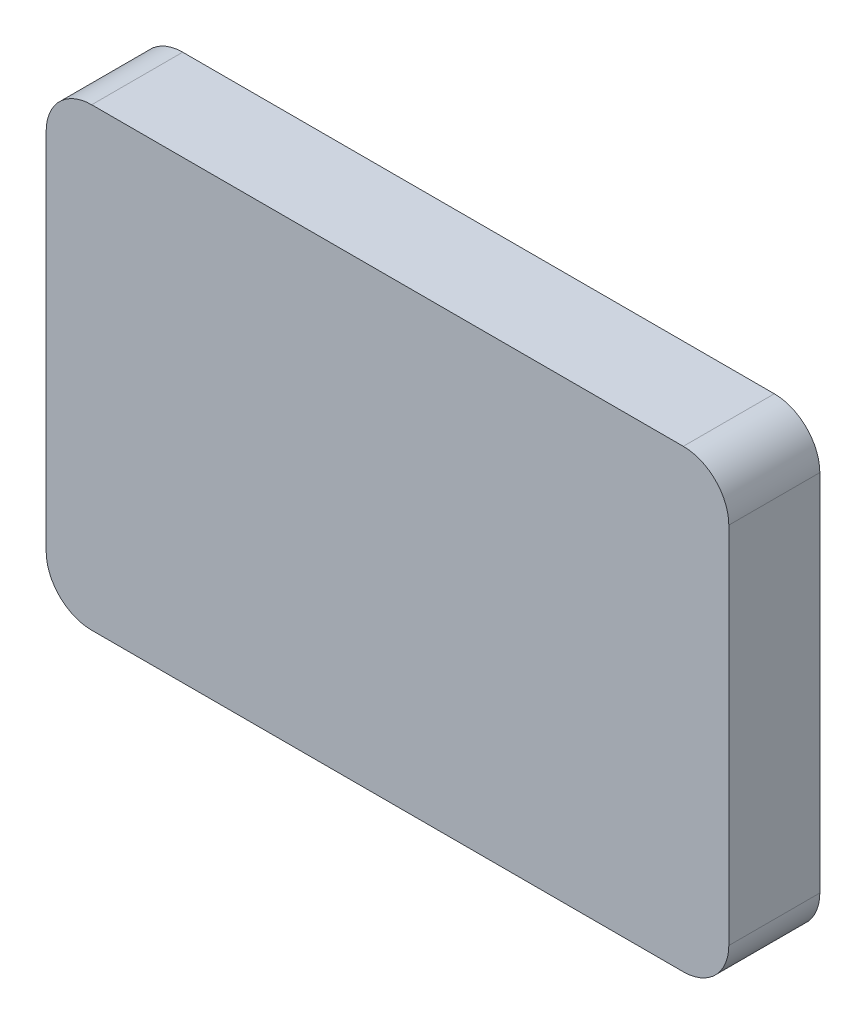
ISO-10303-21;
HEADER;
FILE_DESCRIPTION(('STEP AP214'),'2;1');
FILE_NAME('part.step','',(''),(''),'','','');
FILE_SCHEMA(('AUTOMOTIVE_DESIGN { 1 0 10303 214 1 1 1 1 }'));
ENDSEC;
DATA;
#1=APPLICATION_CONTEXT('core data for automotive mechanical design processes');
#2=APPLICATION_PROTOCOL_DEFINITION('international standard','automotive_design',2000,#1);
#3=PRODUCT_CONTEXT('',#1,'mechanical');
#4=PRODUCT('Part','Part','',(#3));
#5=PRODUCT_RELATED_PRODUCT_CATEGORY('part','',(#4));
#6=PRODUCT_DEFINITION_FORMATION('','',#4);
#7=PRODUCT_DEFINITION_CONTEXT('part definition',#1,'design');
#8=PRODUCT_DEFINITION('design','',#6,#7);
#9=PRODUCT_DEFINITION_SHAPE('','',#8);
#10=(LENGTH_UNIT() NAMED_UNIT(*) SI_UNIT(.MILLI.,.METRE.));
#11=(NAMED_UNIT(*) PLANE_ANGLE_UNIT() SI_UNIT($,.RADIAN.));
#12=(NAMED_UNIT(*) SI_UNIT($,.STERADIAN.) SOLID_ANGLE_UNIT());
#13=UNCERTAINTY_MEASURE_WITH_UNIT(LENGTH_MEASURE(1.E-05),#10,'distance_accuracy_value','');
#14=(GEOMETRIC_REPRESENTATION_CONTEXT(3) GLOBAL_UNCERTAINTY_ASSIGNED_CONTEXT((#13)) GLOBAL_UNIT_ASSIGNED_CONTEXT((#10,
#11,#12)) REPRESENTATION_CONTEXT('',''));
#15=CARTESIAN_POINT('',(0.,0.,0.));
#16=DIRECTION('',(0.,0.,1.));
#17=DIRECTION('',(1.,0.,0.));
#18=AXIS2_PLACEMENT_3D('',#15,#16,#17);
#19=CARTESIAN_POINT('',(0.,0.,2.));
#20=DIRECTION('',(0.,1.,0.));
#21=DIRECTION('',(0.,0.,1.));
#22=AXIS2_PLACEMENT_3D('',#19,#20,#21);
#23=PLANE('',#22);
#24=DIRECTION('',(1.,0.,0.));
#25=VECTOR('',#24,1.);
#26=CARTESIAN_POINT('',(0.,0.,2.));
#27=LINE('',#26,#25);
#28=CARTESIAN_POINT('',(1.,0.,2.));
#29=VERTEX_POINT('',#28);
#30=CARTESIAN_POINT('',(14.,0.,2.));
#31=VERTEX_POINT('',#30);
#32=EDGE_CURVE('E120',#29,#31,#27,.T.);
#33=ORIENTED_EDGE('',*,*,#32,.F.);
#34=DIRECTION('',(0.,0.,-1.));
#35=VECTOR('',#34,1.);
#36=CARTESIAN_POINT('',(1.,0.,0.));
#37=LINE('',#36,#35);
#38=CARTESIAN_POINT('',(1.,0.,0.));
#39=VERTEX_POINT('',#38);
#40=EDGE_CURVE('E105',#29,#39,#37,.T.);
#41=ORIENTED_EDGE('',*,*,#40,.T.);
#42=DIRECTION('',(1.,0.,0.));
#43=VECTOR('',#42,1.);
#44=CARTESIAN_POINT('',(0.,0.,0.));
#45=LINE('',#44,#43);
#46=CARTESIAN_POINT('',(14.,0.,0.));
#47=VERTEX_POINT('',#46);
#48=EDGE_CURVE('E117',#39,#47,#45,.T.);
#49=ORIENTED_EDGE('',*,*,#48,.T.);
#50=DIRECTION('',(0.,0.,-1.));
#51=VECTOR('',#50,1.);
#52=CARTESIAN_POINT('',(14.,0.,2.));
#53=LINE('',#52,#51);
#54=EDGE_CURVE('E122',#47,#31,#53,.F.);
#55=ORIENTED_EDGE('',*,*,#54,.T.);
#56=EDGE_LOOP('',(#33,#41,#49,#55));
#57=FACE_BOUND('',#56,.T.);
#58=ADVANCED_FACE('F35',(#57),#23,.F.);
#59=CARTESIAN_POINT('',(15.,0.,2.));
#60=DIRECTION('',(-1.,0.,0.));
#61=DIRECTION('',(0.,0.,1.));
#62=AXIS2_PLACEMENT_3D('',#59,#60,#61);
#63=PLANE('',#62);
#64=DIRECTION('',(0.,1.,0.));
#65=VECTOR('',#64,1.);
#66=CARTESIAN_POINT('',(15.,0.,2.));
#67=LINE('',#66,#65);
#68=CARTESIAN_POINT('',(15.,1.,2.));
#69=VERTEX_POINT('',#68);
#70=CARTESIAN_POINT('',(15.,9.,2.));
#71=VERTEX_POINT('',#70);
#72=EDGE_CURVE('E163',#69,#71,#67,.T.);
#73=ORIENTED_EDGE('',*,*,#72,.F.);
#74=DIRECTION('',(0.,0.,-1.));
#75=VECTOR('',#74,1.);
#76=CARTESIAN_POINT('',(15.,1.,2.));
#77=LINE('',#76,#75);
#78=CARTESIAN_POINT('',(15.,1.,0.));
#79=VERTEX_POINT('',#78);
#80=EDGE_CURVE('E156',#69,#79,#77,.T.);
#81=ORIENTED_EDGE('',*,*,#80,.T.);
#82=DIRECTION('',(0.,1.,0.));
#83=VECTOR('',#82,1.);
#84=CARTESIAN_POINT('',(15.,0.,0.));
#85=LINE('',#84,#83);
#86=CARTESIAN_POINT('',(15.,9.,0.));
#87=VERTEX_POINT('',#86);
#88=EDGE_CURVE('E126',#79,#87,#85,.T.);
#89=ORIENTED_EDGE('',*,*,#88,.T.);
#90=DIRECTION('',(0.,0.,-1.));
#91=VECTOR('',#90,1.);
#92=CARTESIAN_POINT('',(15.,9.,2.));
#93=LINE('',#92,#91);
#94=EDGE_CURVE('E154',#87,#71,#93,.F.);
#95=ORIENTED_EDGE('',*,*,#94,.T.);
#96=EDGE_LOOP('',(#73,#81,#89,#95));
#97=FACE_BOUND('',#96,.T.);
#98=ADVANCED_FACE('F161',(#97),#63,.F.);
#99=CARTESIAN_POINT('',(0.,10.,2.));
#100=DIRECTION('',(0.,1.,0.));
#101=DIRECTION('',(0.,0.,1.));
#102=AXIS2_PLACEMENT_3D('',#99,#100,#101);
#103=PLANE('',#102);
#104=DIRECTION('',(1.,0.,0.));
#105=VECTOR('',#104,1.);
#106=CARTESIAN_POINT('',(0.,10.,2.));
#107=LINE('',#106,#105);
#108=CARTESIAN_POINT('',(1.,10.,2.));
#109=VERTEX_POINT('',#108);
#110=CARTESIAN_POINT('',(14.,10.,2.));
#111=VERTEX_POINT('',#110);
#112=EDGE_CURVE('E170',#109,#111,#107,.T.);
#113=ORIENTED_EDGE('',*,*,#112,.T.);
#114=DIRECTION('',(0.,0.,-1.));
#115=VECTOR('',#114,1.);
#116=CARTESIAN_POINT('',(14.,10.,0.));
#117=LINE('',#116,#115);
#118=CARTESIAN_POINT('',(14.,10.,0.));
#119=VERTEX_POINT('',#118);
#120=EDGE_CURVE('E11',#111,#119,#117,.T.);
#121=ORIENTED_EDGE('',*,*,#120,.T.);
#122=DIRECTION('',(1.,0.,0.));
#123=VECTOR('',#122,1.);
#124=CARTESIAN_POINT('',(0.,10.,0.));
#125=LINE('',#124,#123);
#126=CARTESIAN_POINT('',(1.,10.,0.));
#127=VERTEX_POINT('',#126);
#128=EDGE_CURVE('E129',#127,#119,#125,.T.);
#129=ORIENTED_EDGE('',*,*,#128,.F.);
#130=DIRECTION('',(0.,0.,-1.));
#131=VECTOR('',#130,1.);
#132=CARTESIAN_POINT('',(1.,10.,2.));
#133=LINE('',#132,#131);
#134=EDGE_CURVE('E43',#127,#109,#133,.F.);
#135=ORIENTED_EDGE('',*,*,#134,.T.);
#136=EDGE_LOOP('',(#113,#121,#129,#135));
#137=FACE_BOUND('',#136,.T.);
#138=ADVANCED_FACE('F169',(#137),#103,.T.);
#139=CARTESIAN_POINT('',(0.,0.,2.));
#140=DIRECTION('',(-1.,0.,0.));
#141=DIRECTION('',(0.,0.,1.));
#142=AXIS2_PLACEMENT_3D('',#139,#140,#141);
#143=PLANE('',#142);
#144=DIRECTION('',(0.,1.,0.));
#145=VECTOR('',#144,1.);
#146=CARTESIAN_POINT('',(0.,0.,0.));
#147=LINE('',#146,#145);
#148=CARTESIAN_POINT('',(0.,1.,0.));
#149=VERTEX_POINT('',#148);
#150=CARTESIAN_POINT('',(0.,9.,0.));
#151=VERTEX_POINT('',#150);
#152=EDGE_CURVE('E137',#149,#151,#147,.T.);
#153=ORIENTED_EDGE('',*,*,#152,.F.);
#154=DIRECTION('',(0.,0.,-1.));
#155=VECTOR('',#154,1.);
#156=CARTESIAN_POINT('',(0.,1.,2.));
#157=LINE('',#156,#155);
#158=CARTESIAN_POINT('',(0.,1.,2.));
#159=VERTEX_POINT('',#158);
#160=EDGE_CURVE('E106',#149,#159,#157,.F.);
#161=ORIENTED_EDGE('',*,*,#160,.T.);
#162=DIRECTION('',(0.,1.,0.));
#163=VECTOR('',#162,1.);
#164=CARTESIAN_POINT('',(0.,0.,2.));
#165=LINE('',#164,#163);
#166=CARTESIAN_POINT('',(0.,9.,2.));
#167=VERTEX_POINT('',#166);
#168=EDGE_CURVE('E132',#159,#167,#165,.T.);
#169=ORIENTED_EDGE('',*,*,#168,.T.);
#170=DIRECTION('',(0.,0.,-1.));
#171=VECTOR('',#170,1.);
#172=CARTESIAN_POINT('',(0.,9.,2.));
#173=LINE('',#172,#171);
#174=EDGE_CURVE('E111',#167,#151,#173,.T.);
#175=ORIENTED_EDGE('',*,*,#174,.T.);
#176=EDGE_LOOP('',(#153,#161,#169,#175));
#177=FACE_BOUND('',#176,.T.);
#178=ADVANCED_FACE('F194',(#177),#143,.T.);
#179=CARTESIAN_POINT('',(0.,0.,2.));
#180=DIRECTION('',(0.,0.,1.));
#181=DIRECTION('',(1.,0.,0.));
#182=AXIS2_PLACEMENT_3D('',#179,#180,#181);
#183=PLANE('',#182);
#184=ORIENTED_EDGE('',*,*,#168,.F.);
#185=CARTESIAN_POINT('',(1.,1.,2.));
#186=DIRECTION('',(0.,0.,1.));
#187=DIRECTION('',(1.,0.,0.));
#188=AXIS2_PLACEMENT_3D('',#185,#186,#187);
#189=CIRCLE('',#188,1.);
#190=EDGE_CURVE('E152',#159,#29,#189,.T.);
#191=ORIENTED_EDGE('',*,*,#190,.T.);
#192=ORIENTED_EDGE('',*,*,#32,.T.);
#193=CARTESIAN_POINT('',(14.,1.,2.));
#194=DIRECTION('',(0.,0.,1.));
#195=DIRECTION('',(1.,0.,0.));
#196=AXIS2_PLACEMENT_3D('',#193,#194,#195);
#197=CIRCLE('',#196,1.);
#198=EDGE_CURVE('E150',#31,#69,#197,.T.);
#199=ORIENTED_EDGE('',*,*,#198,.T.);
#200=ORIENTED_EDGE('',*,*,#72,.T.);
#201=CARTESIAN_POINT('',(14.,9.,2.));
#202=DIRECTION('',(0.,0.,1.));
#203=DIRECTION('',(1.,0.,0.));
#204=AXIS2_PLACEMENT_3D('',#201,#202,#203);
#205=CIRCLE('',#204,1.);
#206=EDGE_CURVE('E50',#71,#111,#205,.T.);
#207=ORIENTED_EDGE('',*,*,#206,.T.);
#208=ORIENTED_EDGE('',*,*,#112,.F.);
#209=CARTESIAN_POINT('',(1.,9.,2.));
#210=DIRECTION('',(0.,0.,1.));
#211=DIRECTION('',(1.,0.,0.));
#212=AXIS2_PLACEMENT_3D('',#209,#210,#211);
#213=CIRCLE('',#212,1.);
#214=EDGE_CURVE('E147',#109,#167,#213,.T.);
#215=ORIENTED_EDGE('',*,*,#214,.T.);
#216=EDGE_LOOP('',(#184,#191,#192,#199,#200,#207,#208,#215));
#217=FACE_BOUND('',#216,.T.);
#218=ADVANCED_FACE('F176',(#217),#183,.T.);
#219=CARTESIAN_POINT('',(0.,0.,0.));
#220=DIRECTION('',(0.,0.,1.));
#221=DIRECTION('',(1.,0.,0.));
#222=AXIS2_PLACEMENT_3D('',#219,#220,#221);
#223=PLANE('',#222);
#224=ORIENTED_EDGE('',*,*,#48,.F.);
#225=CARTESIAN_POINT('',(1.,1.,0.));
#226=DIRECTION('',(0.,0.,1.));
#227=DIRECTION('',(1.,0.,0.));
#228=AXIS2_PLACEMENT_3D('',#225,#226,#227);
#229=CIRCLE('',#228,1.);
#230=EDGE_CURVE('E101',#39,#149,#229,.F.);
#231=ORIENTED_EDGE('',*,*,#230,.T.);
#232=ORIENTED_EDGE('',*,*,#152,.T.);
#233=CARTESIAN_POINT('',(1.,9.,0.));
#234=DIRECTION('',(0.,0.,1.));
#235=DIRECTION('',(1.,0.,0.));
#236=AXIS2_PLACEMENT_3D('',#233,#234,#235);
#237=CIRCLE('',#236,1.);
#238=EDGE_CURVE('E121',#151,#127,#237,.F.);
#239=ORIENTED_EDGE('',*,*,#238,.T.);
#240=ORIENTED_EDGE('',*,*,#128,.T.);
#241=CARTESIAN_POINT('',(14.,9.,0.));
#242=DIRECTION('',(0.,0.,1.));
#243=DIRECTION('',(1.,0.,0.));
#244=AXIS2_PLACEMENT_3D('',#241,#242,#243);
#245=CIRCLE('',#244,1.);
#246=EDGE_CURVE('E141',#119,#87,#245,.F.);
#247=ORIENTED_EDGE('',*,*,#246,.T.);
#248=ORIENTED_EDGE('',*,*,#88,.F.);
#249=CARTESIAN_POINT('',(14.,1.,0.));
#250=DIRECTION('',(0.,0.,1.));
#251=DIRECTION('',(1.,0.,0.));
#252=AXIS2_PLACEMENT_3D('',#249,#250,#251);
#253=CIRCLE('',#252,1.);
#254=EDGE_CURVE('E112',#79,#47,#253,.F.);
#255=ORIENTED_EDGE('',*,*,#254,.T.);
#256=EDGE_LOOP('',(#224,#231,#232,#239,#240,#247,#248,#255));
#257=FACE_BOUND('',#256,.T.);
#258=ADVANCED_FACE('F124',(#257),#223,.F.);
#259=CARTESIAN_POINT('',(1.,1.,2.));
#260=DIRECTION('',(0.,0.,1.));
#261=DIRECTION('',(1.,0.,0.));
#262=AXIS2_PLACEMENT_3D('',#259,#260,#261);
#263=CYLINDRICAL_SURFACE('',#262,1.);
#264=ORIENTED_EDGE('',*,*,#190,.F.);
#265=ORIENTED_EDGE('',*,*,#160,.F.);
#266=ORIENTED_EDGE('',*,*,#230,.F.);
#267=ORIENTED_EDGE('',*,*,#40,.F.);
#268=EDGE_LOOP('',(#264,#265,#266,#267));
#269=FACE_BOUND('',#268,.T.);
#270=ADVANCED_FACE('F104',(#269),#263,.T.);
#271=CARTESIAN_POINT('',(14.,1.,2.));
#272=DIRECTION('',(0.,0.,-1.));
#273=DIRECTION('',(-1.,0.,0.));
#274=AXIS2_PLACEMENT_3D('',#271,#272,#273);
#275=CYLINDRICAL_SURFACE('',#274,1.);
#276=ORIENTED_EDGE('',*,*,#198,.F.);
#277=ORIENTED_EDGE('',*,*,#54,.F.);
#278=ORIENTED_EDGE('',*,*,#254,.F.);
#279=ORIENTED_EDGE('',*,*,#80,.F.);
#280=EDGE_LOOP('',(#276,#277,#278,#279));
#281=FACE_BOUND('',#280,.T.);
#282=ADVANCED_FACE('F177',(#281),#275,.T.);
#283=CARTESIAN_POINT('',(14.,9.,2.));
#284=DIRECTION('',(0.,0.,1.));
#285=DIRECTION('',(1.,0.,0.));
#286=AXIS2_PLACEMENT_3D('',#283,#284,#285);
#287=CYLINDRICAL_SURFACE('',#286,1.);
#288=ORIENTED_EDGE('',*,*,#206,.F.);
#289=ORIENTED_EDGE('',*,*,#94,.F.);
#290=ORIENTED_EDGE('',*,*,#246,.F.);
#291=ORIENTED_EDGE('',*,*,#120,.F.);
#292=EDGE_LOOP('',(#288,#289,#290,#291));
#293=FACE_BOUND('',#292,.T.);
#294=ADVANCED_FACE('F168',(#293),#287,.T.);
#295=CARTESIAN_POINT('',(1.,9.,2.));
#296=DIRECTION('',(0.,0.,-1.));
#297=DIRECTION('',(-1.,0.,0.));
#298=AXIS2_PLACEMENT_3D('',#295,#296,#297);
#299=CYLINDRICAL_SURFACE('',#298,1.);
#300=ORIENTED_EDGE('',*,*,#214,.F.);
#301=ORIENTED_EDGE('',*,*,#134,.F.);
#302=ORIENTED_EDGE('',*,*,#238,.F.);
#303=ORIENTED_EDGE('',*,*,#174,.F.);
#304=EDGE_LOOP('',(#300,#301,#302,#303));
#305=FACE_BOUND('',#304,.T.);
#306=ADVANCED_FACE('F37',(#305),#299,.T.);
#307=CLOSED_SHELL('',(#58,#98,#138,#178,#218,#258,#270,#282,#294,#306));
#308=MANIFOLD_SOLID_BREP('B2',#307);
#309=ADVANCED_BREP_SHAPE_REPRESENTATION('',(#18,#308),#14);
#310=SHAPE_DEFINITION_REPRESENTATION(#9,#309);
ENDSEC;
END-ISO-10303-21;
